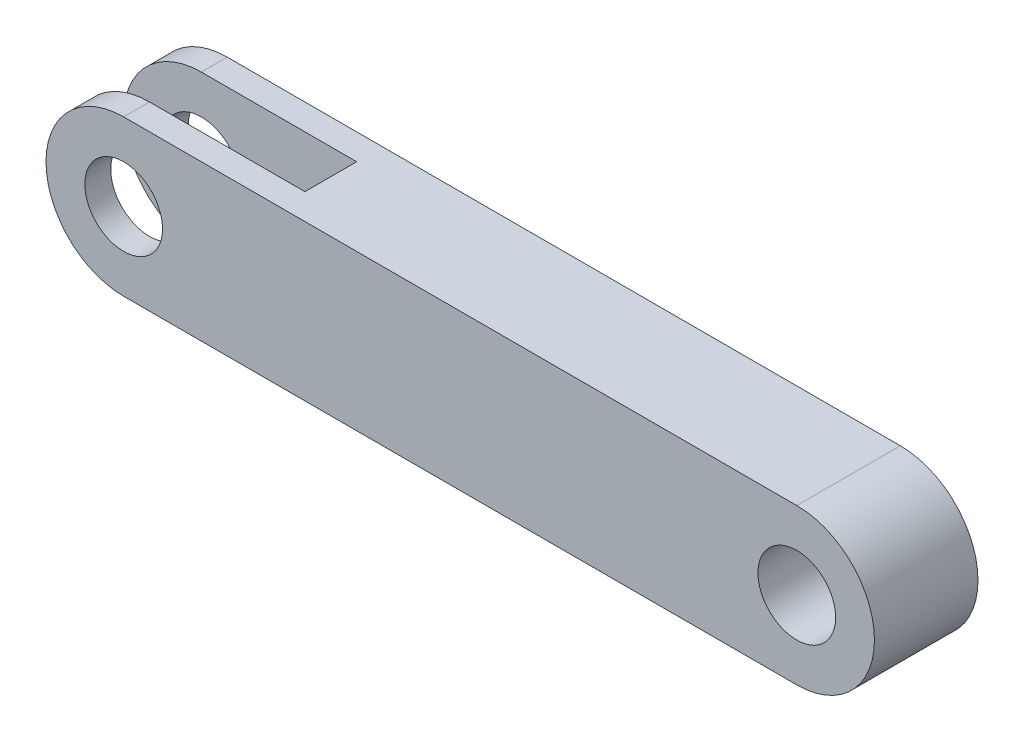
ISO-10303-21;
HEADER;
FILE_DESCRIPTION(('STEP AP214'),'2;1');
FILE_NAME('part.step','',(''),(''),'','','');
FILE_SCHEMA(('AUTOMOTIVE_DESIGN { 1 0 10303 214 1 1 1 1 }'));
ENDSEC;
DATA;
#1=APPLICATION_CONTEXT('core data for automotive mechanical design processes');
#2=APPLICATION_PROTOCOL_DEFINITION('international standard','automotive_design',2000,#1);
#3=PRODUCT_CONTEXT('',#1,'mechanical');
#4=PRODUCT('Part','Part','',(#3));
#5=PRODUCT_RELATED_PRODUCT_CATEGORY('part','',(#4));
#6=PRODUCT_DEFINITION_FORMATION('','',#4);
#7=PRODUCT_DEFINITION_CONTEXT('part definition',#1,'design');
#8=PRODUCT_DEFINITION('design','',#6,#7);
#9=PRODUCT_DEFINITION_SHAPE('','',#8);
#10=(LENGTH_UNIT() NAMED_UNIT(*) SI_UNIT(.MILLI.,.METRE.));
#11=(NAMED_UNIT(*) PLANE_ANGLE_UNIT() SI_UNIT($,.RADIAN.));
#12=(NAMED_UNIT(*) SI_UNIT($,.STERADIAN.) SOLID_ANGLE_UNIT());
#13=UNCERTAINTY_MEASURE_WITH_UNIT(LENGTH_MEASURE(1.E-05),#10,'distance_accuracy_value','');
#14=(GEOMETRIC_REPRESENTATION_CONTEXT(3) GLOBAL_UNCERTAINTY_ASSIGNED_CONTEXT((#13)) GLOBAL_UNIT_ASSIGNED_CONTEXT((#10,
#11,#12)) REPRESENTATION_CONTEXT('',''));
#15=CARTESIAN_POINT('',(0.,0.,0.));
#16=DIRECTION('',(0.,0.,1.));
#17=DIRECTION('',(1.,0.,0.));
#18=AXIS2_PLACEMENT_3D('',#15,#16,#17);
#19=CARTESIAN_POINT('',(-26.,0.,8.));
#20=DIRECTION('',(0.,0.,-1.));
#21=DIRECTION('',(-1.,0.,0.));
#22=AXIS2_PLACEMENT_3D('',#19,#20,#21);
#23=CYLINDRICAL_SURFACE('',#22,6.);
#24=CARTESIAN_POINT('',(-26.,0.,2.));
#25=DIRECTION('',(0.,0.,-1.));
#26=DIRECTION('',(-1.,0.,0.));
#27=AXIS2_PLACEMENT_3D('',#24,#25,#26);
#28=CIRCLE('',#27,6.);
#29=CARTESIAN_POINT('',(-26.,-6.00000000000001,2.));
#30=VERTEX_POINT('',#29);
#31=CARTESIAN_POINT('',(-26.,6.,2.));
#32=VERTEX_POINT('',#31);
#33=EDGE_CURVE('E155',#30,#32,#28,.T.);
#34=ORIENTED_EDGE('',*,*,#33,.T.);
#35=DIRECTION('',(0.,0.,-1.));
#36=VECTOR('',#35,1.);
#37=CARTESIAN_POINT('',(-26.,6.,8.));
#38=LINE('',#37,#36);
#39=CARTESIAN_POINT('',(-26.,6.,0.));
#40=VERTEX_POINT('',#39);
#41=EDGE_CURVE('E88',#32,#40,#38,.T.);
#42=ORIENTED_EDGE('',*,*,#41,.T.);
#43=CARTESIAN_POINT('',(-26.,0.,0.));
#44=DIRECTION('',(0.,0.,1.));
#45=DIRECTION('',(1.,0.,0.));
#46=AXIS2_PLACEMENT_3D('',#43,#44,#45);
#47=CIRCLE('',#46,6.);
#48=CARTESIAN_POINT('',(-26.,-6.,0.));
#49=VERTEX_POINT('',#48);
#50=EDGE_CURVE('E171',#40,#49,#47,.T.);
#51=ORIENTED_EDGE('',*,*,#50,.T.);
#52=DIRECTION('',(0.,0.,-1.));
#53=VECTOR('',#52,1.);
#54=CARTESIAN_POINT('',(-26.,-6.,8.));
#55=LINE('',#54,#53);
#56=EDGE_CURVE('E49',#30,#49,#55,.T.);
#57=ORIENTED_EDGE('',*,*,#56,.F.);
#58=EDGE_LOOP('',(#34,#42,#51,#57));
#59=FACE_BOUND('',#58,.T.);
#60=ADVANCED_FACE('F39',(#59),#23,.T.);
#61=CARTESIAN_POINT('',(-26.,0.,8.));
#62=DIRECTION('',(0.,0.,-1.));
#63=DIRECTION('',(-1.,0.,0.));
#64=AXIS2_PLACEMENT_3D('',#61,#62,#63);
#65=CYLINDRICAL_SURFACE('',#64,3.);
#66=CARTESIAN_POINT('',(-26.,0.,2.));
#67=DIRECTION('',(0.,0.,-1.));
#68=DIRECTION('',(-1.,0.,0.));
#69=AXIS2_PLACEMENT_3D('',#66,#67,#68);
#70=CIRCLE('',#69,3.);
#71=CARTESIAN_POINT('',(-29.,0.,2.));
#72=VERTEX_POINT('',#71);
#73=EDGE_CURVE('E43',#72,#72,#70,.T.);
#74=ORIENTED_EDGE('',*,*,#73,.F.);
#75=EDGE_LOOP('',(#74));
#76=FACE_BOUND('',#75,.T.);
#77=CARTESIAN_POINT('',(-26.,0.,0.));
#78=DIRECTION('',(0.,0.,1.));
#79=DIRECTION('',(1.,0.,0.));
#80=AXIS2_PLACEMENT_3D('',#77,#78,#79);
#81=CIRCLE('',#80,3.);
#82=CARTESIAN_POINT('',(-23.,0.,0.));
#83=VERTEX_POINT('',#82);
#84=EDGE_CURVE('E163',#83,#83,#81,.T.);
#85=ORIENTED_EDGE('',*,*,#84,.F.);
#86=EDGE_LOOP('',(#85));
#87=FACE_BOUND('',#86,.T.);
#88=ADVANCED_FACE('F218',(#76,#87),#65,.F.);
#89=CARTESIAN_POINT('',(-26.,0.,8.));
#90=DIRECTION('',(0.,0.,1.));
#91=DIRECTION('',(1.,0.,0.));
#92=AXIS2_PLACEMENT_3D('',#89,#90,#91);
#93=PLANE('',#92);
#94=CARTESIAN_POINT('',(-26.,0.,8.));
#95=DIRECTION('',(0.,0.,1.));
#96=DIRECTION('',(1.,0.,0.));
#97=AXIS2_PLACEMENT_3D('',#94,#95,#96);
#98=CIRCLE('',#97,3.);
#99=CARTESIAN_POINT('',(-23.,0.,8.));
#100=VERTEX_POINT('',#99);
#101=EDGE_CURVE('E167',#100,#100,#98,.T.);
#102=ORIENTED_EDGE('',*,*,#101,.F.);
#103=EDGE_LOOP('',(#102));
#104=FACE_BOUND('',#103,.T.);
#105=CARTESIAN_POINT('',(-26.,0.,8.));
#106=DIRECTION('',(0.,0.,1.));
#107=DIRECTION('',(1.,0.,0.));
#108=AXIS2_PLACEMENT_3D('',#105,#106,#107);
#109=CIRCLE('',#108,6.);
#110=CARTESIAN_POINT('',(-26.,6.,8.));
#111=VERTEX_POINT('',#110);
#112=CARTESIAN_POINT('',(-26.,-6.,8.));
#113=VERTEX_POINT('',#112);
#114=EDGE_CURVE('E175',#111,#113,#109,.T.);
#115=ORIENTED_EDGE('',*,*,#114,.T.);
#116=DIRECTION('',(1.,0.,0.));
#117=VECTOR('',#116,1.);
#118=CARTESIAN_POINT('',(-26.,-6.,8.));
#119=LINE('',#118,#117);
#120=CARTESIAN_POINT('',(26.,-5.99999999999999,8.));
#121=VERTEX_POINT('',#120);
#122=EDGE_CURVE('E95',#113,#121,#119,.T.);
#123=ORIENTED_EDGE('',*,*,#122,.T.);
#124=CARTESIAN_POINT('',(26.,0.,8.));
#125=DIRECTION('',(0.,0.,1.));
#126=DIRECTION('',(1.,0.,0.));
#127=AXIS2_PLACEMENT_3D('',#124,#125,#126);
#128=CIRCLE('',#127,6.);
#129=CARTESIAN_POINT('',(26.,6.00000000000001,8.));
#130=VERTEX_POINT('',#129);
#131=EDGE_CURVE('E181',#121,#130,#128,.T.);
#132=ORIENTED_EDGE('',*,*,#131,.T.);
#133=DIRECTION('',(-1.,0.,0.));
#134=VECTOR('',#133,1.);
#135=CARTESIAN_POINT('',(-26.,6.,8.));
#136=LINE('',#135,#134);
#137=EDGE_CURVE('E66',#130,#111,#136,.T.);
#138=ORIENTED_EDGE('',*,*,#137,.T.);
#139=EDGE_LOOP('',(#115,#123,#132,#138));
#140=FACE_BOUND('',#139,.T.);
#141=CARTESIAN_POINT('',(26.,0.,8.));
#142=DIRECTION('',(0.,0.,1.));
#143=DIRECTION('',(1.,0.,0.));
#144=AXIS2_PLACEMENT_3D('',#141,#142,#143);
#145=CIRCLE('',#144,3.);
#146=CARTESIAN_POINT('',(29.,0.,8.));
#147=VERTEX_POINT('',#146);
#148=EDGE_CURVE('E159',#147,#147,#145,.T.);
#149=ORIENTED_EDGE('',*,*,#148,.F.);
#150=EDGE_LOOP('',(#149));
#151=FACE_BOUND('',#150,.T.);
#152=ADVANCED_FACE('F221',(#104,#140,#151),#93,.T.);
#153=CARTESIAN_POINT('',(-26.,0.,0.));
#154=DIRECTION('',(0.,0.,1.));
#155=DIRECTION('',(1.,0.,0.));
#156=AXIS2_PLACEMENT_3D('',#153,#154,#155);
#157=PLANE('',#156);
#158=ORIENTED_EDGE('',*,*,#50,.F.);
#159=DIRECTION('',(-1.,0.,0.));
#160=VECTOR('',#159,1.);
#161=CARTESIAN_POINT('',(-26.,6.,0.));
#162=LINE('',#161,#160);
#163=CARTESIAN_POINT('',(26.,6.00000000000001,0.));
#164=VERTEX_POINT('',#163);
#165=EDGE_CURVE('E178',#164,#40,#162,.T.);
#166=ORIENTED_EDGE('',*,*,#165,.F.);
#167=CARTESIAN_POINT('',(26.,0.,0.));
#168=DIRECTION('',(0.,0.,1.));
#169=DIRECTION('',(1.,0.,0.));
#170=AXIS2_PLACEMENT_3D('',#167,#168,#169);
#171=CIRCLE('',#170,6.);
#172=CARTESIAN_POINT('',(26.,-5.99999999999999,0.));
#173=VERTEX_POINT('',#172);
#174=EDGE_CURVE('E191',#173,#164,#171,.T.);
#175=ORIENTED_EDGE('',*,*,#174,.F.);
#176=DIRECTION('',(1.,0.,0.));
#177=VECTOR('',#176,1.);
#178=CARTESIAN_POINT('',(-26.,-6.,0.));
#179=LINE('',#178,#177);
#180=EDGE_CURVE('E188',#49,#173,#179,.T.);
#181=ORIENTED_EDGE('',*,*,#180,.F.);
#182=EDGE_LOOP('',(#158,#166,#175,#181));
#183=FACE_BOUND('',#182,.T.);
#184=ORIENTED_EDGE('',*,*,#84,.T.);
#185=EDGE_LOOP('',(#184));
#186=FACE_BOUND('',#185,.T.);
#187=CARTESIAN_POINT('',(26.,0.,0.));
#188=DIRECTION('',(0.,0.,1.));
#189=DIRECTION('',(1.,0.,0.));
#190=AXIS2_PLACEMENT_3D('',#187,#188,#189);
#191=CIRCLE('',#190,3.);
#192=CARTESIAN_POINT('',(29.,0.,0.));
#193=VERTEX_POINT('',#192);
#194=EDGE_CURVE('E158',#193,#193,#191,.T.);
#195=ORIENTED_EDGE('',*,*,#194,.T.);
#196=EDGE_LOOP('',(#195));
#197=FACE_BOUND('',#196,.T.);
#198=ADVANCED_FACE('F223',(#183,#186,#197),#157,.F.);
#199=CARTESIAN_POINT('',(-26.,6.,6.));
#200=VERTEX_POINT('',#199);
#201=EDGE_CURVE('E196',#111,#200,#38,.T.);
#202=ORIENTED_EDGE('',*,*,#201,.T.);
#203=CARTESIAN_POINT('',(-26.,0.,6.));
#204=DIRECTION('',(0.,0.,1.));
#205=DIRECTION('',(1.,0.,0.));
#206=AXIS2_PLACEMENT_3D('',#203,#204,#205);
#207=CIRCLE('',#206,6.);
#208=CARTESIAN_POINT('',(-26.,-6.00000000000001,6.));
#209=VERTEX_POINT('',#208);
#210=EDGE_CURVE('E57',#200,#209,#207,.T.);
#211=ORIENTED_EDGE('',*,*,#210,.T.);
#212=EDGE_CURVE('E11',#113,#209,#55,.T.);
#213=ORIENTED_EDGE('',*,*,#212,.F.);
#214=ORIENTED_EDGE('',*,*,#114,.F.);
#215=EDGE_LOOP('',(#202,#211,#213,#214));
#216=FACE_BOUND('',#215,.T.);
#217=ADVANCED_FACE('F41',(#216),#23,.T.);
#218=CARTESIAN_POINT('',(-26.,-6.,8.));
#219=DIRECTION('',(0.,1.,0.));
#220=DIRECTION('',(-1.,0.,0.));
#221=AXIS2_PLACEMENT_3D('',#218,#219,#220);
#222=PLANE('',#221);
#223=DIRECTION('',(0.,0.,-1.));
#224=VECTOR('',#223,1.);
#225=CARTESIAN_POINT('',(-14.,-6.00000000000001,2.));
#226=LINE('',#225,#224);
#227=CARTESIAN_POINT('',(-14.,-6.00000000000001,6.));
#228=VERTEX_POINT('',#227);
#229=CARTESIAN_POINT('',(-14.,-6.00000000000001,2.));
#230=VERTEX_POINT('',#229);
#231=EDGE_CURVE('E128',#228,#230,#226,.T.);
#232=ORIENTED_EDGE('',*,*,#231,.T.);
#233=DIRECTION('',(-1.,0.,0.));
#234=VECTOR('',#233,1.);
#235=CARTESIAN_POINT('',(-32.,-6.00000000000001,2.));
#236=LINE('',#235,#234);
#237=EDGE_CURVE('E125',#230,#30,#236,.T.);
#238=ORIENTED_EDGE('',*,*,#237,.T.);
#239=ORIENTED_EDGE('',*,*,#56,.T.);
#240=ORIENTED_EDGE('',*,*,#180,.T.);
#241=DIRECTION('',(0.,0.,-1.));
#242=VECTOR('',#241,1.);
#243=CARTESIAN_POINT('',(26.,-5.99999999999999,8.));
#244=LINE('',#243,#242);
#245=EDGE_CURVE('E204',#121,#173,#244,.T.);
#246=ORIENTED_EDGE('',*,*,#245,.F.);
#247=ORIENTED_EDGE('',*,*,#122,.F.);
#248=ORIENTED_EDGE('',*,*,#212,.T.);
#249=DIRECTION('',(1.,0.,0.));
#250=VECTOR('',#249,1.);
#251=CARTESIAN_POINT('',(-32.,-6.00000000000001,6.));
#252=LINE('',#251,#250);
#253=EDGE_CURVE('E118',#209,#228,#252,.T.);
#254=ORIENTED_EDGE('',*,*,#253,.T.);
#255=EDGE_LOOP('',(#232,#238,#239,#240,#246,#247,#248,#254));
#256=FACE_BOUND('',#255,.T.);
#257=ADVANCED_FACE('F134',(#256),#222,.F.);
#258=CARTESIAN_POINT('',(26.,0.,8.));
#259=DIRECTION('',(0.,0.,-1.));
#260=DIRECTION('',(-1.,0.,0.));
#261=AXIS2_PLACEMENT_3D('',#258,#259,#260);
#262=CYLINDRICAL_SURFACE('',#261,6.);
#263=ORIENTED_EDGE('',*,*,#174,.T.);
#264=DIRECTION('',(0.,0.,-1.));
#265=VECTOR('',#264,1.);
#266=CARTESIAN_POINT('',(26.,6.00000000000001,8.));
#267=LINE('',#266,#265);
#268=EDGE_CURVE('E200',#130,#164,#267,.T.);
#269=ORIENTED_EDGE('',*,*,#268,.F.);
#270=ORIENTED_EDGE('',*,*,#131,.F.);
#271=ORIENTED_EDGE('',*,*,#245,.T.);
#272=EDGE_LOOP('',(#263,#269,#270,#271));
#273=FACE_BOUND('',#272,.T.);
#274=ADVANCED_FACE('F297',(#273),#262,.T.);
#275=CARTESIAN_POINT('',(-26.,6.,8.));
#276=DIRECTION('',(0.,-1.,0.));
#277=DIRECTION('',(1.,0.,0.));
#278=AXIS2_PLACEMENT_3D('',#275,#276,#277);
#279=PLANE('',#278);
#280=ORIENTED_EDGE('',*,*,#41,.F.);
#281=DIRECTION('',(-1.,0.,0.));
#282=VECTOR('',#281,1.);
#283=CARTESIAN_POINT('',(-32.,6.,2.));
#284=LINE('',#283,#282);
#285=CARTESIAN_POINT('',(-14.,6.,2.));
#286=VERTEX_POINT('',#285);
#287=EDGE_CURVE('E137',#286,#32,#284,.T.);
#288=ORIENTED_EDGE('',*,*,#287,.F.);
#289=DIRECTION('',(0.,0.,-1.));
#290=VECTOR('',#289,1.);
#291=CARTESIAN_POINT('',(-14.,6.,2.));
#292=LINE('',#291,#290);
#293=CARTESIAN_POINT('',(-14.,6.,6.));
#294=VERTEX_POINT('',#293);
#295=EDGE_CURVE('E141',#294,#286,#292,.T.);
#296=ORIENTED_EDGE('',*,*,#295,.F.);
#297=DIRECTION('',(1.,0.,0.));
#298=VECTOR('',#297,1.);
#299=CARTESIAN_POINT('',(-32.,6.,6.));
#300=LINE('',#299,#298);
#301=EDGE_CURVE('E119',#200,#294,#300,.T.);
#302=ORIENTED_EDGE('',*,*,#301,.F.);
#303=ORIENTED_EDGE('',*,*,#201,.F.);
#304=ORIENTED_EDGE('',*,*,#137,.F.);
#305=ORIENTED_EDGE('',*,*,#268,.T.);
#306=ORIENTED_EDGE('',*,*,#165,.T.);
#307=EDGE_LOOP('',(#280,#288,#296,#302,#303,#304,#305,#306));
#308=FACE_BOUND('',#307,.T.);
#309=ADVANCED_FACE('F216',(#308),#279,.F.);
#310=CARTESIAN_POINT('',(-26.,0.,6.));
#311=DIRECTION('',(0.,0.,1.));
#312=DIRECTION('',(1.,0.,0.));
#313=AXIS2_PLACEMENT_3D('',#310,#311,#312);
#314=CIRCLE('',#313,3.);
#315=CARTESIAN_POINT('',(-23.,0.,6.));
#316=VERTEX_POINT('',#315);
#317=EDGE_CURVE('E151',#316,#316,#314,.T.);
#318=ORIENTED_EDGE('',*,*,#317,.F.);
#319=EDGE_LOOP('',(#318));
#320=FACE_BOUND('',#319,.T.);
#321=ORIENTED_EDGE('',*,*,#101,.T.);
#322=EDGE_LOOP('',(#321));
#323=FACE_BOUND('',#322,.T.);
#324=ADVANCED_FACE('F212',(#320,#323),#65,.F.);
#325=CARTESIAN_POINT('',(26.,0.,8.));
#326=DIRECTION('',(0.,0.,-1.));
#327=DIRECTION('',(-1.,0.,0.));
#328=AXIS2_PLACEMENT_3D('',#325,#326,#327);
#329=CYLINDRICAL_SURFACE('',#328,3.);
#330=ORIENTED_EDGE('',*,*,#148,.T.);
#331=EDGE_LOOP('',(#330));
#332=FACE_BOUND('',#331,.T.);
#333=ORIENTED_EDGE('',*,*,#194,.F.);
#334=EDGE_LOOP('',(#333));
#335=FACE_BOUND('',#334,.T.);
#336=ADVANCED_FACE('F215',(#332,#335),#329,.F.);
#337=CARTESIAN_POINT('',(-32.,-6.00000000000001,2.));
#338=DIRECTION('',(0.,0.,-1.));
#339=DIRECTION('',(-1.,0.,0.));
#340=AXIS2_PLACEMENT_3D('',#337,#338,#339);
#341=PLANE('',#340);
#342=ORIENTED_EDGE('',*,*,#73,.T.);
#343=EDGE_LOOP('',(#342));
#344=FACE_BOUND('',#343,.T.);
#345=ORIENTED_EDGE('',*,*,#33,.F.);
#346=ORIENTED_EDGE('',*,*,#237,.F.);
#347=DIRECTION('',(0.,1.,0.));
#348=VECTOR('',#347,1.);
#349=CARTESIAN_POINT('',(-14.,-6.00000000000001,2.));
#350=LINE('',#349,#348);
#351=EDGE_CURVE('E124',#230,#286,#350,.T.);
#352=ORIENTED_EDGE('',*,*,#351,.T.);
#353=ORIENTED_EDGE('',*,*,#287,.T.);
#354=EDGE_LOOP('',(#345,#346,#352,#353));
#355=FACE_BOUND('',#354,.T.);
#356=ADVANCED_FACE('F231',(#344,#355),#341,.F.);
#357=CARTESIAN_POINT('',(-32.,-6.00000000000001,6.));
#358=DIRECTION('',(0.,0.,1.));
#359=DIRECTION('',(1.,0.,0.));
#360=AXIS2_PLACEMENT_3D('',#357,#358,#359);
#361=PLANE('',#360);
#362=ORIENTED_EDGE('',*,*,#317,.T.);
#363=EDGE_LOOP('',(#362));
#364=FACE_BOUND('',#363,.T.);
#365=ORIENTED_EDGE('',*,*,#301,.T.);
#366=DIRECTION('',(0.,1.,0.));
#367=VECTOR('',#366,1.);
#368=CARTESIAN_POINT('',(-14.,-6.00000000000001,6.));
#369=LINE('',#368,#367);
#370=EDGE_CURVE('E114',#228,#294,#369,.T.);
#371=ORIENTED_EDGE('',*,*,#370,.F.);
#372=ORIENTED_EDGE('',*,*,#253,.F.);
#373=ORIENTED_EDGE('',*,*,#210,.F.);
#374=EDGE_LOOP('',(#365,#371,#372,#373));
#375=FACE_BOUND('',#374,.T.);
#376=ADVANCED_FACE('F116',(#364,#375),#361,.F.);
#377=CARTESIAN_POINT('',(-14.,-6.00000000000001,2.));
#378=DIRECTION('',(1.,0.,0.));
#379=DIRECTION('',(0.,1.,0.));
#380=AXIS2_PLACEMENT_3D('',#377,#378,#379);
#381=PLANE('',#380);
#382=ORIENTED_EDGE('',*,*,#295,.T.);
#383=ORIENTED_EDGE('',*,*,#351,.F.);
#384=ORIENTED_EDGE('',*,*,#231,.F.);
#385=ORIENTED_EDGE('',*,*,#370,.T.);
#386=EDGE_LOOP('',(#382,#383,#384,#385));
#387=FACE_BOUND('',#386,.T.);
#388=ADVANCED_FACE('F129',(#387),#381,.F.);
#389=CLOSED_SHELL('',(#60,#88,#152,#198,#217,#257,#274,#309,#324,#336,#356,#376,#388));
#390=MANIFOLD_SOLID_BREP('B2',#389);
#391=ADVANCED_BREP_SHAPE_REPRESENTATION('',(#18,#390),#14);
#392=SHAPE_DEFINITION_REPRESENTATION(#9,#391);
ENDSEC;
END-ISO-10303-21;
